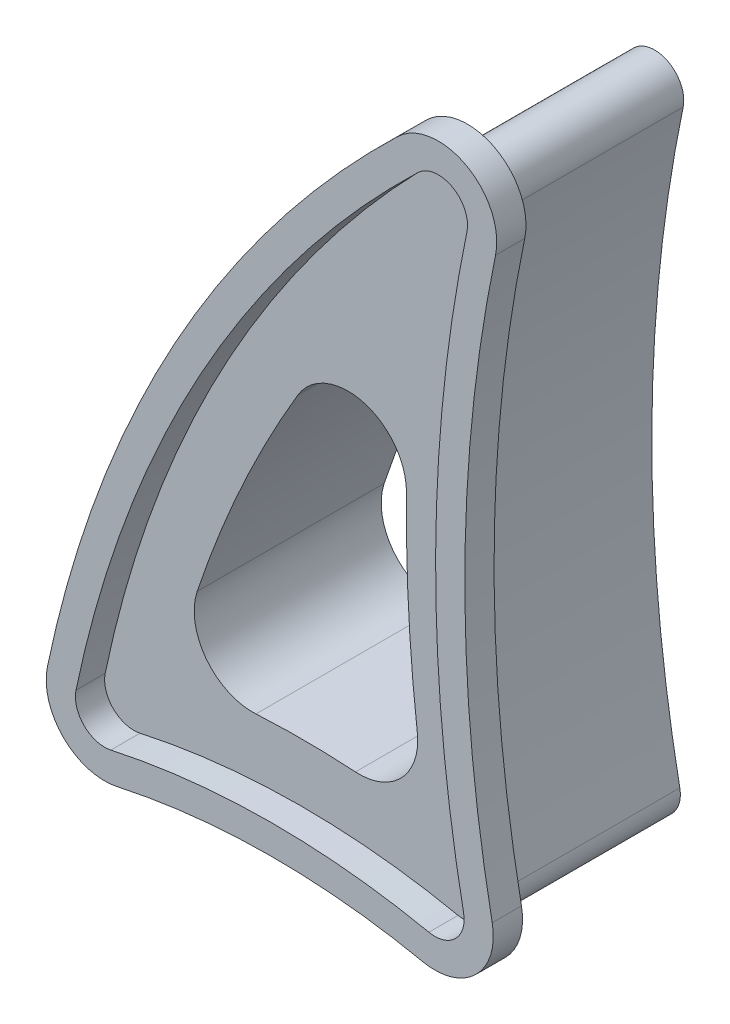
ISO-10303-21;
HEADER;
FILE_DESCRIPTION(('STEP AP214'),'2;1');
FILE_NAME('part.step','',(''),(''),'','','');
FILE_SCHEMA(('AUTOMOTIVE_DESIGN { 1 0 10303 214 1 1 1 1 }'));
ENDSEC;
DATA;
#1=APPLICATION_CONTEXT('core data for automotive mechanical design processes');
#2=APPLICATION_PROTOCOL_DEFINITION('international standard','automotive_design',2000,#1);
#3=PRODUCT_CONTEXT('',#1,'mechanical');
#4=PRODUCT('Part','Part','',(#3));
#5=PRODUCT_RELATED_PRODUCT_CATEGORY('part','',(#4));
#6=PRODUCT_DEFINITION_FORMATION('','',#4);
#7=PRODUCT_DEFINITION_CONTEXT('part definition',#1,'design');
#8=PRODUCT_DEFINITION('design','',#6,#7);
#9=PRODUCT_DEFINITION_SHAPE('','',#8);
#10=(LENGTH_UNIT() NAMED_UNIT(*) SI_UNIT(.MILLI.,.METRE.));
#11=(NAMED_UNIT(*) PLANE_ANGLE_UNIT() SI_UNIT($,.RADIAN.));
#12=(NAMED_UNIT(*) SI_UNIT($,.STERADIAN.) SOLID_ANGLE_UNIT());
#13=UNCERTAINTY_MEASURE_WITH_UNIT(LENGTH_MEASURE(1.E-05),#10,'distance_accuracy_value','');
#14=(GEOMETRIC_REPRESENTATION_CONTEXT(3) GLOBAL_UNCERTAINTY_ASSIGNED_CONTEXT((#13)) GLOBAL_UNIT_ASSIGNED_CONTEXT((#10,
#11,#12)) REPRESENTATION_CONTEXT('',''));
#15=CARTESIAN_POINT('',(0.,0.,0.));
#16=DIRECTION('',(0.,0.,1.));
#17=DIRECTION('',(1.,0.,0.));
#18=AXIS2_PLACEMENT_3D('',#15,#16,#17);
#19=CARTESIAN_POINT('',(48.320297770506,12.8510242148101,1.));
#20=DIRECTION('',(0.,0.,-1.));
#21=DIRECTION('',(-1.,0.,0.));
#22=AXIS2_PLACEMENT_3D('',#19,#20,#21);
#23=CYLINDRICAL_SURFACE('',#22,50.);
#24=CARTESIAN_POINT('',(48.320297770506,12.8510242148101,0.));
#25=DIRECTION('',(0.,0.,1.));
#26=DIRECTION('',(1.,0.,0.));
#27=AXIS2_PLACEMENT_3D('',#24,#25,#26);
#28=CIRCLE('',#27,50.);
#29=CARTESIAN_POINT('',(-0.741475267234573,3.21035896840541,0.));
#30=VERTEX_POINT('',#29);
#31=CARTESIAN_POINT('',(-0.628577803238606,23.0494348785397,0.));
#32=VERTEX_POINT('',#31);
#33=EDGE_CURVE('E190',#30,#32,#28,.F.);
#34=ORIENTED_EDGE('',*,*,#33,.T.);
#35=DIRECTION('',(0.,0.,-1.));
#36=VECTOR('',#35,1.);
#37=CARTESIAN_POINT('',(-0.628577803238606,23.0494348785397,1.));
#38=LINE('',#37,#36);
#39=CARTESIAN_POINT('',(-0.628577803238606,23.0494348785397,1.));
#40=VERTEX_POINT('',#39);
#41=EDGE_CURVE('E12',#40,#32,#38,.T.);
#42=ORIENTED_EDGE('',*,*,#41,.F.);
#43=CARTESIAN_POINT('',(48.320297770506,12.8510242148101,1.));
#44=DIRECTION('',(0.,0.,1.));
#45=DIRECTION('',(1.,0.,0.));
#46=AXIS2_PLACEMENT_3D('',#43,#44,#45);
#47=CIRCLE('',#46,50.);
#48=CARTESIAN_POINT('',(-0.741475267234573,3.21035896840541,1.));
#49=VERTEX_POINT('',#48);
#50=EDGE_CURVE('E249',#49,#40,#47,.F.);
#51=ORIENTED_EDGE('',*,*,#50,.F.);
#52=DIRECTION('',(0.,0.,-1.));
#53=VECTOR('',#52,1.);
#54=CARTESIAN_POINT('',(-0.741475267234573,3.21035896840541,1.));
#55=LINE('',#54,#53);
#56=EDGE_CURVE('E202',#49,#30,#55,.T.);
#57=ORIENTED_EDGE('',*,*,#56,.T.);
#58=EDGE_LOOP('',(#34,#42,#51,#57));
#59=FACE_BOUND('',#58,.T.);
#60=ADVANCED_FACE('F47',(#59),#23,.F.);
#61=CARTESIAN_POINT('',(-2.58653282618839,23.4573713050889,1.));
#62=DIRECTION('',(0.,0.,-1.));
#63=DIRECTION('',(-1.,0.,0.));
#64=AXIS2_PLACEMENT_3D('',#61,#62,#63);
#65=CYLINDRICAL_SURFACE('',#64,2.);
#66=CARTESIAN_POINT('',(-2.58653282618839,23.4573713050889,0.));
#67=DIRECTION('',(0.,0.,1.));
#68=DIRECTION('',(1.,0.,0.));
#69=AXIS2_PLACEMENT_3D('',#66,#67,#68);
#70=CIRCLE('',#69,2.);
#71=CARTESIAN_POINT('',(-3.97370372975359,24.8981200286011,0.));
#72=VERTEX_POINT('',#71);
#73=EDGE_CURVE('E193',#32,#72,#70,.T.);
#74=ORIENTED_EDGE('',*,*,#73,.T.);
#75=DIRECTION('',(0.,0.,-1.));
#76=VECTOR('',#75,1.);
#77=CARTESIAN_POINT('',(-3.97370372975359,24.8981200286011,1.));
#78=LINE('',#77,#76);
#79=CARTESIAN_POINT('',(-3.97370372975359,24.8981200286011,1.));
#80=VERTEX_POINT('',#79);
#81=EDGE_CURVE('E57',#80,#72,#78,.T.);
#82=ORIENTED_EDGE('',*,*,#81,.F.);
#83=CARTESIAN_POINT('',(-2.58653282618839,23.4573713050889,1.));
#84=DIRECTION('',(0.,0.,1.));
#85=DIRECTION('',(1.,0.,0.));
#86=AXIS2_PLACEMENT_3D('',#83,#84,#85);
#87=CIRCLE('',#86,2.);
#88=EDGE_CURVE('E166',#40,#80,#87,.T.);
#89=ORIENTED_EDGE('',*,*,#88,.F.);
#90=ORIENTED_EDGE('',*,*,#41,.T.);
#91=EDGE_LOOP('',(#74,#82,#89,#90));
#92=FACE_BOUND('',#91,.T.);
#93=ADVANCED_FACE('F254',(#92),#65,.T.);
#94=CARTESIAN_POINT('',(25.1568852451154,-5.35760316515583,1.));
#95=DIRECTION('',(0.,0.,-1.));
#96=DIRECTION('',(-1.,0.,0.));
#97=AXIS2_PLACEMENT_3D('',#94,#95,#96);
#98=CYLINDRICAL_SURFACE('',#97,42.);
#99=CARTESIAN_POINT('',(25.1568852451154,-5.35760316515583,0.));
#100=DIRECTION('',(0.,0.,1.));
#101=DIRECTION('',(1.,0.,0.));
#102=AXIS2_PLACEMENT_3D('',#99,#100,#101);
#103=CIRCLE('',#102,42.);
#104=CARTESIAN_POINT('',(-15.9648626723684,3.1865087378403,0.));
#105=VERTEX_POINT('',#104);
#106=EDGE_CURVE('E195',#72,#105,#103,.T.);
#107=ORIENTED_EDGE('',*,*,#106,.T.);
#108=DIRECTION('',(0.,0.,-1.));
#109=VECTOR('',#108,1.);
#110=CARTESIAN_POINT('',(-15.9648626723684,3.1865087378403,1.));
#111=LINE('',#110,#109);
#112=CARTESIAN_POINT('',(-15.9648626723684,3.1865087378403,1.));
#113=VERTEX_POINT('',#112);
#114=EDGE_CURVE('E155',#113,#105,#111,.T.);
#115=ORIENTED_EDGE('',*,*,#114,.F.);
#116=CARTESIAN_POINT('',(25.1568852451154,-5.35760316515583,1.));
#117=DIRECTION('',(0.,0.,1.));
#118=DIRECTION('',(1.,0.,0.));
#119=AXIS2_PLACEMENT_3D('',#116,#117,#118);
#120=CIRCLE('',#119,42.);
#121=EDGE_CURVE('E163',#80,#113,#120,.T.);
#122=ORIENTED_EDGE('',*,*,#121,.F.);
#123=ORIENTED_EDGE('',*,*,#81,.T.);
#124=EDGE_LOOP('',(#107,#115,#122,#123));
#125=FACE_BOUND('',#124,.T.);
#126=ADVANCED_FACE('F257',(#125),#98,.T.);
#127=CARTESIAN_POINT('',(-14.0066842001072,2.77964626626907,1.));
#128=DIRECTION('',(0.,0.,-1.));
#129=DIRECTION('',(-1.,0.,0.));
#130=AXIS2_PLACEMENT_3D('',#127,#128,#129);
#131=CYLINDRICAL_SURFACE('',#130,2.);
#132=CARTESIAN_POINT('',(-14.0066842001072,2.77964626626907,0.));
#133=DIRECTION('',(0.,0.,1.));
#134=DIRECTION('',(1.,0.,0.));
#135=AXIS2_PLACEMENT_3D('',#132,#133,#134);
#136=CIRCLE('',#135,2.);
#137=CARTESIAN_POINT('',(-13.5802631482474,0.825633705784666,0.));
#138=VERTEX_POINT('',#137);
#139=EDGE_CURVE('E154',#138,#105,#136,.F.);
#140=ORIENTED_EDGE('',*,*,#139,.F.);
#141=DIRECTION('',(0.,0.,-1.));
#142=VECTOR('',#141,1.);
#143=CARTESIAN_POINT('',(-13.5802631482474,0.825633705784666,1.));
#144=LINE('',#143,#142);
#145=CARTESIAN_POINT('',(-13.5802631482474,0.825633705784666,1.));
#146=VERTEX_POINT('',#145);
#147=EDGE_CURVE('E148',#146,#138,#144,.T.);
#148=ORIENTED_EDGE('',*,*,#147,.F.);
#149=CARTESIAN_POINT('',(-14.0066842001072,2.77964626626907,1.));
#150=DIRECTION('',(0.,0.,1.));
#151=DIRECTION('',(1.,0.,0.));
#152=AXIS2_PLACEMENT_3D('',#149,#150,#151);
#153=CIRCLE('',#152,2.);
#154=EDGE_CURVE('E152',#146,#113,#153,.F.);
#155=ORIENTED_EDGE('',*,*,#154,.T.);
#156=ORIENTED_EDGE('',*,*,#114,.T.);
#157=EDGE_LOOP('',(#140,#148,#155,#156));
#158=FACE_BOUND('',#157,.T.);
#159=ADVANCED_FACE('F150',(#158),#131,.T.);
#160=CARTESIAN_POINT('',(-8.25,-23.5995233002703,1.));
#161=DIRECTION('',(0.,0.,-1.));
#162=DIRECTION('',(-1.,0.,0.));
#163=AXIS2_PLACEMENT_3D('',#160,#161,#162);
#164=CYLINDRICAL_SURFACE('',#163,25.);
#165=CARTESIAN_POINT('',(-8.25,-23.5995233002703,0.));
#166=DIRECTION('',(0.,0.,1.));
#167=DIRECTION('',(1.,0.,0.));
#168=AXIS2_PLACEMENT_3D('',#165,#166,#167);
#169=CIRCLE('',#168,25.);
#170=CARTESIAN_POINT('',(-3.11476498957796,0.867380087525561,0.));
#171=VERTEX_POINT('',#170);
#172=EDGE_CURVE('E106',#138,#171,#169,.F.);
#173=ORIENTED_EDGE('',*,*,#172,.T.);
#174=DIRECTION('',(0.,0.,-1.));
#175=VECTOR('',#174,1.);
#176=CARTESIAN_POINT('',(-3.11476498957796,0.867380087525561,1.));
#177=LINE('',#176,#175);
#178=CARTESIAN_POINT('',(-3.11476498957796,0.867380087525561,1.));
#179=VERTEX_POINT('',#178);
#180=EDGE_CURVE('E156',#179,#171,#177,.T.);
#181=ORIENTED_EDGE('',*,*,#180,.F.);
#182=CARTESIAN_POINT('',(-8.25,-23.5995233002703,1.));
#183=DIRECTION('',(0.,0.,1.));
#184=DIRECTION('',(1.,0.,0.));
#185=AXIS2_PLACEMENT_3D('',#182,#183,#184);
#186=CIRCLE('',#185,25.);
#187=EDGE_CURVE('E158',#146,#179,#186,.F.);
#188=ORIENTED_EDGE('',*,*,#187,.F.);
#189=ORIENTED_EDGE('',*,*,#147,.T.);
#190=EDGE_LOOP('',(#173,#181,#188,#189));
#191=FACE_BOUND('',#190,.T.);
#192=ADVANCED_FACE('F159',(#191),#164,.F.);
#193=CARTESIAN_POINT('',(-2.58653282618839,23.4573713050889,1.));
#194=DIRECTION('',(0.,0.,-1.));
#195=DIRECTION('',(-1.,0.,0.));
#196=AXIS2_PLACEMENT_3D('',#193,#194,#195);
#197=CYLINDRICAL_SURFACE('',#196,1.);
#198=CARTESIAN_POINT('',(-2.58653282618839,23.4573713050889,0.));
#199=DIRECTION('',(0.,0.,1.));
#200=DIRECTION('',(1.,0.,0.));
#201=AXIS2_PLACEMENT_3D('',#198,#199,#200);
#202=CIRCLE('',#201,1.);
#203=CARTESIAN_POINT('',(-1.60755531471349,23.2534030918143,0.));
#204=VERTEX_POINT('',#203);
#205=CARTESIAN_POINT('',(-3.28011827797098,24.177745666845,0.));
#206=VERTEX_POINT('',#205);
#207=EDGE_CURVE('E172',#204,#206,#202,.T.);
#208=ORIENTED_EDGE('',*,*,#207,.F.);
#209=DIRECTION('',(0.,0.,-1.));
#210=VECTOR('',#209,1.);
#211=CARTESIAN_POINT('',(-1.60755531471349,23.2534030918143,1.));
#212=LINE('',#211,#210);
#213=CARTESIAN_POINT('',(-1.60755531471349,23.2534030918143,1.));
#214=VERTEX_POINT('',#213);
#215=EDGE_CURVE('E51',#214,#204,#212,.T.);
#216=ORIENTED_EDGE('',*,*,#215,.F.);
#217=CARTESIAN_POINT('',(-2.58653282618839,23.4573713050889,1.));
#218=DIRECTION('',(0.,0.,1.));
#219=DIRECTION('',(1.,0.,0.));
#220=AXIS2_PLACEMENT_3D('',#217,#218,#219);
#221=CIRCLE('',#220,1.);
#222=CARTESIAN_POINT('',(-3.28011827797098,24.177745666845,1.));
#223=VERTEX_POINT('',#222);
#224=EDGE_CURVE('E201',#214,#223,#221,.T.);
#225=ORIENTED_EDGE('',*,*,#224,.T.);
#226=DIRECTION('',(0.,0.,-1.));
#227=VECTOR('',#226,1.);
#228=CARTESIAN_POINT('',(-3.28011827797098,24.177745666845,1.));
#229=LINE('',#228,#227);
#230=EDGE_CURVE('E171',#223,#206,#229,.T.);
#231=ORIENTED_EDGE('',*,*,#230,.T.);
#232=EDGE_LOOP('',(#208,#216,#225,#231));
#233=FACE_BOUND('',#232,.T.);
#234=ADVANCED_FACE('F49',(#233),#197,.F.);
#235=CARTESIAN_POINT('',(48.320297770506,12.8510242148101,1.));
#236=DIRECTION('',(0.,0.,-1.));
#237=DIRECTION('',(-1.,0.,0.));
#238=AXIS2_PLACEMENT_3D('',#235,#236,#237);
#239=CYLINDRICAL_SURFACE('',#238,51.);
#240=CARTESIAN_POINT('',(48.320297770506,12.8510242148101,0.));
#241=DIRECTION('',(0.,0.,1.));
#242=DIRECTION('',(1.,0.,0.));
#243=AXIS2_PLACEMENT_3D('',#240,#241,#242);
#244=CIRCLE('',#243,51.);
#245=CARTESIAN_POINT('',(-1.72271072798938,3.01754566347732,0.));
#246=VERTEX_POINT('',#245);
#247=EDGE_CURVE('E175',#246,#204,#244,.F.);
#248=ORIENTED_EDGE('',*,*,#247,.F.);
#249=DIRECTION('',(0.,0.,-1.));
#250=VECTOR('',#249,1.);
#251=CARTESIAN_POINT('',(-1.72271072798938,3.01754566347732,1.));
#252=LINE('',#251,#250);
#253=CARTESIAN_POINT('',(-1.72271072798938,3.01754566347732,1.));
#254=VERTEX_POINT('',#253);
#255=EDGE_CURVE('E214',#254,#246,#252,.T.);
#256=ORIENTED_EDGE('',*,*,#255,.F.);
#257=CARTESIAN_POINT('',(48.320297770506,12.8510242148101,1.));
#258=DIRECTION('',(0.,0.,1.));
#259=DIRECTION('',(1.,0.,0.));
#260=AXIS2_PLACEMENT_3D('',#257,#258,#259);
#261=CIRCLE('',#260,51.);
#262=EDGE_CURVE('E223',#254,#214,#261,.F.);
#263=ORIENTED_EDGE('',*,*,#262,.T.);
#264=ORIENTED_EDGE('',*,*,#215,.T.);
#265=EDGE_LOOP('',(#248,#256,#263,#264));
#266=FACE_BOUND('',#265,.T.);
#267=ADVANCED_FACE('F221',(#266),#239,.T.);
#268=CARTESIAN_POINT('',(-2.70394618874419,2.82473235854923,1.));
#269=DIRECTION('',(0.,0.,-1.));
#270=DIRECTION('',(-1.,0.,0.));
#271=AXIS2_PLACEMENT_3D('',#268,#269,#270);
#272=CYLINDRICAL_SURFACE('',#271,1.);
#273=CARTESIAN_POINT('',(-2.70394618874419,2.82473235854923,0.));
#274=DIRECTION('',(0.,0.,1.));
#275=DIRECTION('',(1.,0.,0.));
#276=AXIS2_PLACEMENT_3D('',#273,#274,#275);
#277=CIRCLE('',#276,1.);
#278=CARTESIAN_POINT('',(-2.90935558916107,1.84605622303739,0.));
#279=VERTEX_POINT('',#278);
#280=EDGE_CURVE('E178',#279,#246,#277,.T.);
#281=ORIENTED_EDGE('',*,*,#280,.F.);
#282=DIRECTION('',(0.,0.,-1.));
#283=VECTOR('',#282,1.);
#284=CARTESIAN_POINT('',(-2.90935558916107,1.84605622303739,1.));
#285=LINE('',#284,#283);
#286=CARTESIAN_POINT('',(-2.90935558916107,1.84605622303739,1.));
#287=VERTEX_POINT('',#286);
#288=EDGE_CURVE('E213',#287,#279,#285,.T.);
#289=ORIENTED_EDGE('',*,*,#288,.F.);
#290=CARTESIAN_POINT('',(-2.70394618874419,2.82473235854923,1.));
#291=DIRECTION('',(0.,0.,1.));
#292=DIRECTION('',(1.,0.,0.));
#293=AXIS2_PLACEMENT_3D('',#290,#291,#292);
#294=CIRCLE('',#293,1.);
#295=EDGE_CURVE('E232',#287,#254,#294,.T.);
#296=ORIENTED_EDGE('',*,*,#295,.T.);
#297=ORIENTED_EDGE('',*,*,#255,.T.);
#298=EDGE_LOOP('',(#281,#289,#296,#297));
#299=FACE_BOUND('',#298,.T.);
#300=ADVANCED_FACE('F230',(#299),#272,.F.);
#301=CARTESIAN_POINT('',(-8.25,-23.5995233002703,1.));
#302=DIRECTION('',(0.,0.,-1.));
#303=DIRECTION('',(-1.,0.,0.));
#304=AXIS2_PLACEMENT_3D('',#301,#302,#303);
#305=CYLINDRICAL_SURFACE('',#304,26.);
#306=CARTESIAN_POINT('',(-8.25,-23.5995233002703,0.));
#307=DIRECTION('',(0.,0.,1.));
#308=DIRECTION('',(1.,0.,0.));
#309=AXIS2_PLACEMENT_3D('',#306,#307,#308);
#310=CIRCLE('',#309,26.);
#311=CARTESIAN_POINT('',(-13.7934736741773,1.80263998602687,0.));
#312=VERTEX_POINT('',#311);
#313=EDGE_CURVE('E181',#312,#279,#310,.F.);
#314=ORIENTED_EDGE('',*,*,#313,.F.);
#315=DIRECTION('',(0.,0.,-1.));
#316=VECTOR('',#315,1.);
#317=CARTESIAN_POINT('',(-13.7934736741773,1.80263998602687,1.));
#318=LINE('',#317,#316);
#319=CARTESIAN_POINT('',(-13.7934736741773,1.80263998602687,1.));
#320=VERTEX_POINT('',#319);
#321=EDGE_CURVE('E211',#320,#312,#318,.T.);
#322=ORIENTED_EDGE('',*,*,#321,.F.);
#323=CARTESIAN_POINT('',(-8.25,-23.5995233002703,1.));
#324=DIRECTION('',(0.,0.,1.));
#325=DIRECTION('',(1.,0.,0.));
#326=AXIS2_PLACEMENT_3D('',#323,#324,#325);
#327=CIRCLE('',#326,26.);
#328=EDGE_CURVE('E237',#320,#287,#327,.F.);
#329=ORIENTED_EDGE('',*,*,#328,.T.);
#330=ORIENTED_EDGE('',*,*,#288,.T.);
#331=EDGE_LOOP('',(#314,#322,#329,#330));
#332=FACE_BOUND('',#331,.T.);
#333=ADVANCED_FACE('F239',(#332),#305,.T.);
#334=CARTESIAN_POINT('',(-14.0066842001072,2.77964626626907,1.));
#335=DIRECTION('',(0.,0.,-1.));
#336=DIRECTION('',(-1.,0.,0.));
#337=AXIS2_PLACEMENT_3D('',#334,#335,#336);
#338=CYLINDRICAL_SURFACE('',#337,0.999999999999997);
#339=CARTESIAN_POINT('',(-14.0066842001072,2.77964626626907,0.));
#340=DIRECTION('',(0.,0.,1.));
#341=DIRECTION('',(1.,0.,0.));
#342=AXIS2_PLACEMENT_3D('',#339,#340,#341);
#343=CIRCLE('',#342,0.999999999999997);
#344=CARTESIAN_POINT('',(-14.9857734362378,2.9830775020547,0.));
#345=VERTEX_POINT('',#344);
#346=EDGE_CURVE('E184',#312,#345,#343,.F.);
#347=ORIENTED_EDGE('',*,*,#346,.T.);
#348=DIRECTION('',(0.,0.,-1.));
#349=VECTOR('',#348,1.);
#350=CARTESIAN_POINT('',(-14.9857734362378,2.9830775020547,1.));
#351=LINE('',#350,#349);
#352=CARTESIAN_POINT('',(-14.9857734362378,2.9830775020547,1.));
#353=VERTEX_POINT('',#352);
#354=EDGE_CURVE('E209',#353,#345,#351,.T.);
#355=ORIENTED_EDGE('',*,*,#354,.F.);
#356=CARTESIAN_POINT('',(-14.0066842001072,2.77964626626907,1.));
#357=DIRECTION('',(0.,0.,1.));
#358=DIRECTION('',(1.,0.,0.));
#359=AXIS2_PLACEMENT_3D('',#356,#357,#358);
#360=CIRCLE('',#359,0.999999999999997);
#361=EDGE_CURVE('E241',#320,#353,#360,.F.);
#362=ORIENTED_EDGE('',*,*,#361,.F.);
#363=ORIENTED_EDGE('',*,*,#321,.T.);
#364=EDGE_LOOP('',(#347,#355,#362,#363));
#365=FACE_BOUND('',#364,.T.);
#366=ADVANCED_FACE('F269',(#365),#338,.F.);
#367=CARTESIAN_POINT('',(25.1568852451154,-5.35760316515583,1.));
#368=DIRECTION('',(0.,0.,-1.));
#369=DIRECTION('',(-1.,0.,0.));
#370=AXIS2_PLACEMENT_3D('',#367,#368,#369);
#371=CYLINDRICAL_SURFACE('',#370,41.);
#372=CARTESIAN_POINT('',(25.1568852451154,-5.35760316515583,0.));
#373=DIRECTION('',(0.,0.,1.));
#374=DIRECTION('',(1.,0.,0.));
#375=AXIS2_PLACEMENT_3D('',#372,#373,#374);
#376=CIRCLE('',#375,41.);
#377=EDGE_CURVE('E187',#206,#345,#376,.T.);
#378=ORIENTED_EDGE('',*,*,#377,.F.);
#379=ORIENTED_EDGE('',*,*,#230,.F.);
#380=CARTESIAN_POINT('',(25.1568852451154,-5.35760316515583,1.));
#381=DIRECTION('',(0.,0.,1.));
#382=DIRECTION('',(1.,0.,0.));
#383=AXIS2_PLACEMENT_3D('',#380,#381,#382);
#384=CIRCLE('',#383,41.);
#385=EDGE_CURVE('E243',#223,#353,#384,.T.);
#386=ORIENTED_EDGE('',*,*,#385,.T.);
#387=ORIENTED_EDGE('',*,*,#354,.T.);
#388=EDGE_LOOP('',(#378,#379,#386,#387));
#389=FACE_BOUND('',#388,.T.);
#390=ADVANCED_FACE('F262',(#389),#371,.F.);
#391=CARTESIAN_POINT('',(-2.70394618874419,2.82473235854923,1.));
#392=DIRECTION('',(0.,0.,-1.));
#393=DIRECTION('',(-1.,0.,0.));
#394=AXIS2_PLACEMENT_3D('',#391,#392,#393);
#395=CYLINDRICAL_SURFACE('',#394,2.);
#396=CARTESIAN_POINT('',(-2.70394618874419,2.82473235854923,0.));
#397=DIRECTION('',(0.,0.,1.));
#398=DIRECTION('',(1.,0.,0.));
#399=AXIS2_PLACEMENT_3D('',#396,#397,#398);
#400=CIRCLE('',#399,2.);
#401=EDGE_CURVE('E112',#171,#30,#400,.T.);
#402=ORIENTED_EDGE('',*,*,#401,.T.);
#403=ORIENTED_EDGE('',*,*,#56,.F.);
#404=CARTESIAN_POINT('',(-2.70394618874419,2.82473235854923,1.));
#405=DIRECTION('',(0.,0.,1.));
#406=DIRECTION('',(1.,0.,0.));
#407=AXIS2_PLACEMENT_3D('',#404,#405,#406);
#408=CIRCLE('',#407,2.);
#409=EDGE_CURVE('E66',#179,#49,#408,.T.);
#410=ORIENTED_EDGE('',*,*,#409,.F.);
#411=ORIENTED_EDGE('',*,*,#180,.T.);
#412=EDGE_LOOP('',(#402,#403,#410,#411));
#413=FACE_BOUND('',#412,.T.);
#414=ADVANCED_FACE('F260',(#413),#395,.T.);
#415=CARTESIAN_POINT('',(0.,0.,1.));
#416=DIRECTION('',(0.,0.,1.));
#417=DIRECTION('',(1.,0.,0.));
#418=AXIS2_PLACEMENT_3D('',#415,#416,#417);
#419=PLANE('',#418);
#420=ORIENTED_EDGE('',*,*,#224,.F.);
#421=ORIENTED_EDGE('',*,*,#262,.F.);
#422=ORIENTED_EDGE('',*,*,#295,.F.);
#423=ORIENTED_EDGE('',*,*,#328,.F.);
#424=ORIENTED_EDGE('',*,*,#361,.T.);
#425=ORIENTED_EDGE('',*,*,#385,.F.);
#426=EDGE_LOOP('',(#420,#421,#422,#423,#424,#425));
#427=FACE_BOUND('',#426,.T.);
#428=ORIENTED_EDGE('',*,*,#50,.T.);
#429=ORIENTED_EDGE('',*,*,#88,.T.);
#430=ORIENTED_EDGE('',*,*,#121,.T.);
#431=ORIENTED_EDGE('',*,*,#154,.F.);
#432=ORIENTED_EDGE('',*,*,#187,.T.);
#433=ORIENTED_EDGE('',*,*,#409,.T.);
#434=EDGE_LOOP('',(#428,#429,#430,#431,#432,#433));
#435=FACE_BOUND('',#434,.T.);
#436=ADVANCED_FACE('F161',(#427,#435),#419,.T.);
#437=CARTESIAN_POINT('',(0.,0.,0.));
#438=DIRECTION('',(0.,0.,1.));
#439=DIRECTION('',(1.,0.,0.));
#440=AXIS2_PLACEMENT_3D('',#437,#438,#439);
#441=PLANE('',#440);
#442=ORIENTED_EDGE('',*,*,#207,.T.);
#443=ORIENTED_EDGE('',*,*,#377,.T.);
#444=ORIENTED_EDGE('',*,*,#346,.F.);
#445=ORIENTED_EDGE('',*,*,#313,.T.);
#446=ORIENTED_EDGE('',*,*,#280,.T.);
#447=ORIENTED_EDGE('',*,*,#247,.T.);
#448=EDGE_LOOP('',(#442,#443,#444,#445,#446,#447));
#449=FACE_BOUND('',#448,.T.);
#450=ORIENTED_EDGE('',*,*,#33,.F.);
#451=ORIENTED_EDGE('',*,*,#401,.F.);
#452=ORIENTED_EDGE('',*,*,#172,.F.);
#453=ORIENTED_EDGE('',*,*,#139,.T.);
#454=ORIENTED_EDGE('',*,*,#106,.F.);
#455=ORIENTED_EDGE('',*,*,#73,.F.);
#456=EDGE_LOOP('',(#450,#451,#452,#453,#454,#455));
#457=FACE_BOUND('',#456,.T.);
#458=ADVANCED_FACE('F226',(#449,#457),#441,.F.);
#459=CLOSED_SHELL('',(#60,#93,#126,#159,#192,#234,#267,#300,#333,#366,#390,#414,#436,#458));
#460=MANIFOLD_SOLID_BREP('B2',#459);
#461=CARTESIAN_POINT('',(48.320297770506,12.8510242148101,-6.4));
#462=DIRECTION('',(0.,0.,1.));
#463=DIRECTION('',(1.,0.,0.));
#464=AXIS2_PLACEMENT_3D('',#461,#462,#463);
#465=CYLINDRICAL_SURFACE('',#464,51.);
#466=CARTESIAN_POINT('',(48.320297770506,12.8510242148101,0.));
#467=DIRECTION('',(0.,0.,1.));
#468=DIRECTION('',(1.,0.,0.));
#469=AXIS2_PLACEMENT_3D('',#466,#467,#468);
#470=CIRCLE('',#469,51.);
#471=CARTESIAN_POINT('',(-1.72271072798938,3.01754566347732,0.));
#472=VERTEX_POINT('',#471);
#473=CARTESIAN_POINT('',(-1.60755531471349,23.2534030918143,0.));
#474=VERTEX_POINT('',#473);
#475=EDGE_CURVE('E518',#472,#474,#470,.F.);
#476=ORIENTED_EDGE('',*,*,#475,.F.);
#477=DIRECTION('',(0.,0.,1.));
#478=VECTOR('',#477,1.);
#479=CARTESIAN_POINT('',(-1.72271072798938,3.01754566347732,-6.4));
#480=LINE('',#479,#478);
#481=CARTESIAN_POINT('',(-1.72271072798938,3.01754566347732,-6.4));
#482=VERTEX_POINT('',#481);
#483=EDGE_CURVE('E45',#482,#472,#480,.T.);
#484=ORIENTED_EDGE('',*,*,#483,.F.);
#485=CARTESIAN_POINT('',(48.320297770506,12.8510242148101,-6.4));
#486=DIRECTION('',(0.,0.,1.));
#487=DIRECTION('',(1.,0.,0.));
#488=AXIS2_PLACEMENT_3D('',#485,#486,#487);
#489=CIRCLE('',#488,51.);
#490=CARTESIAN_POINT('',(-1.60755531471349,23.2534030918143,-6.4));
#491=VERTEX_POINT('',#490);
#492=EDGE_CURVE('E569',#482,#491,#489,.F.);
#493=ORIENTED_EDGE('',*,*,#492,.T.);
#494=DIRECTION('',(0.,0.,1.));
#495=VECTOR('',#494,1.);
#496=CARTESIAN_POINT('',(-1.60755531471349,23.2534030918143,-6.4));
#497=LINE('',#496,#495);
#498=EDGE_CURVE('E538',#491,#474,#497,.T.);
#499=ORIENTED_EDGE('',*,*,#498,.T.);
#500=EDGE_LOOP('',(#476,#484,#493,#499));
#501=FACE_BOUND('',#500,.T.);
#502=ADVANCED_FACE('F381',(#501),#465,.F.);
#503=CARTESIAN_POINT('',(-2.70394618874419,2.82473235854923,-6.4));
#504=DIRECTION('',(0.,0.,1.));
#505=DIRECTION('',(1.,0.,0.));
#506=AXIS2_PLACEMENT_3D('',#503,#504,#505);
#507=CYLINDRICAL_SURFACE('',#506,1.);
#508=CARTESIAN_POINT('',(-2.70394618874419,2.82473235854923,0.));
#509=DIRECTION('',(0.,0.,1.));
#510=DIRECTION('',(1.,0.,0.));
#511=AXIS2_PLACEMENT_3D('',#508,#509,#510);
#512=CIRCLE('',#511,1.);
#513=CARTESIAN_POINT('',(-2.90935558916107,1.84605622303739,0.));
#514=VERTEX_POINT('',#513);
#515=EDGE_CURVE('E530',#514,#472,#512,.T.);
#516=ORIENTED_EDGE('',*,*,#515,.F.);
#517=DIRECTION('',(0.,0.,1.));
#518=VECTOR('',#517,1.);
#519=CARTESIAN_POINT('',(-2.90935558916107,1.84605622303739,-6.4));
#520=LINE('',#519,#518);
#521=CARTESIAN_POINT('',(-2.90935558916107,1.84605622303739,-6.4));
#522=VERTEX_POINT('',#521);
#523=EDGE_CURVE('E391',#522,#514,#520,.T.);
#524=ORIENTED_EDGE('',*,*,#523,.F.);
#525=CARTESIAN_POINT('',(-2.70394618874419,2.82473235854923,-6.4));
#526=DIRECTION('',(0.,0.,1.));
#527=DIRECTION('',(1.,0.,0.));
#528=AXIS2_PLACEMENT_3D('',#525,#526,#527);
#529=CIRCLE('',#528,1.);
#530=EDGE_CURVE('E498',#522,#482,#529,.T.);
#531=ORIENTED_EDGE('',*,*,#530,.T.);
#532=ORIENTED_EDGE('',*,*,#483,.T.);
#533=EDGE_LOOP('',(#516,#524,#531,#532));
#534=FACE_BOUND('',#533,.T.);
#535=ADVANCED_FACE('F591',(#534),#507,.T.);
#536=CARTESIAN_POINT('',(-8.25,-23.5995233002703,-6.4));
#537=DIRECTION('',(0.,0.,1.));
#538=DIRECTION('',(1.,0.,0.));
#539=AXIS2_PLACEMENT_3D('',#536,#537,#538);
#540=CYLINDRICAL_SURFACE('',#539,26.);
#541=CARTESIAN_POINT('',(-8.25,-23.5995233002703,0.));
#542=DIRECTION('',(0.,0.,1.));
#543=DIRECTION('',(1.,0.,0.));
#544=AXIS2_PLACEMENT_3D('',#541,#542,#543);
#545=CIRCLE('',#544,26.);
#546=CARTESIAN_POINT('',(-13.7934736741773,1.80263998602687,0.));
#547=VERTEX_POINT('',#546);
#548=EDGE_CURVE('E483',#547,#514,#545,.F.);
#549=ORIENTED_EDGE('',*,*,#548,.F.);
#550=DIRECTION('',(0.,0.,1.));
#551=VECTOR('',#550,1.);
#552=CARTESIAN_POINT('',(-13.7934736741773,1.80263998602687,-6.4));
#553=LINE('',#552,#551);
#554=CARTESIAN_POINT('',(-13.7934736741773,1.80263998602687,-6.4));
#555=VERTEX_POINT('',#554);
#556=EDGE_CURVE('E477',#555,#547,#553,.T.);
#557=ORIENTED_EDGE('',*,*,#556,.F.);
#558=CARTESIAN_POINT('',(-8.25,-23.5995233002703,-6.4));
#559=DIRECTION('',(0.,0.,1.));
#560=DIRECTION('',(1.,0.,0.));
#561=AXIS2_PLACEMENT_3D('',#558,#559,#560);
#562=CIRCLE('',#561,26.);
#563=EDGE_CURVE('E481',#555,#522,#562,.F.);
#564=ORIENTED_EDGE('',*,*,#563,.T.);
#565=ORIENTED_EDGE('',*,*,#523,.T.);
#566=EDGE_LOOP('',(#549,#557,#564,#565));
#567=FACE_BOUND('',#566,.T.);
#568=ADVANCED_FACE('F479',(#567),#540,.F.);
#569=CARTESIAN_POINT('',(-14.0066842001072,2.77964626626907,-6.4));
#570=DIRECTION('',(0.,0.,1.));
#571=DIRECTION('',(1.,0.,0.));
#572=AXIS2_PLACEMENT_3D('',#569,#570,#571);
#573=CYLINDRICAL_SURFACE('',#572,0.999999999999997);
#574=CARTESIAN_POINT('',(-14.0066842001072,2.77964626626907,0.));
#575=DIRECTION('',(0.,0.,1.));
#576=DIRECTION('',(1.,0.,0.));
#577=AXIS2_PLACEMENT_3D('',#574,#575,#576);
#578=CIRCLE('',#577,0.999999999999997);
#579=CARTESIAN_POINT('',(-14.9857734362378,2.9830775020547,0.));
#580=VERTEX_POINT('',#579);
#581=EDGE_CURVE('E527',#547,#580,#578,.F.);
#582=ORIENTED_EDGE('',*,*,#581,.T.);
#583=DIRECTION('',(0.,0.,1.));
#584=VECTOR('',#583,1.);
#585=CARTESIAN_POINT('',(-14.9857734362378,2.9830775020547,-6.4));
#586=LINE('',#585,#584);
#587=CARTESIAN_POINT('',(-14.9857734362378,2.9830775020547,-6.4));
#588=VERTEX_POINT('',#587);
#589=EDGE_CURVE('E487',#588,#580,#586,.T.);
#590=ORIENTED_EDGE('',*,*,#589,.F.);
#591=CARTESIAN_POINT('',(-14.0066842001072,2.77964626626907,-6.4));
#592=DIRECTION('',(0.,0.,1.));
#593=DIRECTION('',(1.,0.,0.));
#594=AXIS2_PLACEMENT_3D('',#591,#592,#593);
#595=CIRCLE('',#594,0.999999999999997);
#596=EDGE_CURVE('E490',#555,#588,#595,.F.);
#597=ORIENTED_EDGE('',*,*,#596,.F.);
#598=ORIENTED_EDGE('',*,*,#556,.T.);
#599=EDGE_LOOP('',(#582,#590,#597,#598));
#600=FACE_BOUND('',#599,.T.);
#601=ADVANCED_FACE('F491',(#600),#573,.T.);
#602=CARTESIAN_POINT('',(25.1568852451154,-5.35760316515583,-6.4));
#603=DIRECTION('',(0.,0.,1.));
#604=DIRECTION('',(1.,0.,0.));
#605=AXIS2_PLACEMENT_3D('',#602,#603,#604);
#606=CYLINDRICAL_SURFACE('',#605,41.);
#607=CARTESIAN_POINT('',(25.1568852451154,-5.35760316515583,0.));
#608=DIRECTION('',(0.,0.,1.));
#609=DIRECTION('',(1.,0.,0.));
#610=AXIS2_PLACEMENT_3D('',#607,#608,#609);
#611=CIRCLE('',#610,41.);
#612=CARTESIAN_POINT('',(-3.28011827797098,24.177745666845,0.));
#613=VERTEX_POINT('',#612);
#614=EDGE_CURVE('E524',#613,#580,#611,.T.);
#615=ORIENTED_EDGE('',*,*,#614,.F.);
#616=DIRECTION('',(0.,0.,1.));
#617=VECTOR('',#616,1.);
#618=CARTESIAN_POINT('',(-3.28011827797098,24.177745666845,-6.4));
#619=LINE('',#618,#617);
#620=CARTESIAN_POINT('',(-3.28011827797098,24.177745666845,-6.4));
#621=VERTEX_POINT('',#620);
#622=EDGE_CURVE('E536',#621,#613,#619,.T.);
#623=ORIENTED_EDGE('',*,*,#622,.F.);
#624=CARTESIAN_POINT('',(25.1568852451154,-5.35760316515583,-6.4));
#625=DIRECTION('',(0.,0.,1.));
#626=DIRECTION('',(1.,0.,0.));
#627=AXIS2_PLACEMENT_3D('',#624,#625,#626);
#628=CIRCLE('',#627,41.);
#629=EDGE_CURVE('E495',#621,#588,#628,.T.);
#630=ORIENTED_EDGE('',*,*,#629,.T.);
#631=ORIENTED_EDGE('',*,*,#589,.T.);
#632=EDGE_LOOP('',(#615,#623,#630,#631));
#633=FACE_BOUND('',#632,.T.);
#634=ADVANCED_FACE('F586',(#633),#606,.T.);
#635=CARTESIAN_POINT('',(-6.29253582125286,6.33654748380092,-6.4));
#636=DIRECTION('',(0.,0.,1.));
#637=DIRECTION('',(1.,0.,0.));
#638=AXIS2_PLACEMENT_3D('',#635,#636,#637);
#639=CYLINDRICAL_SURFACE('',#638,2.);
#640=CARTESIAN_POINT('',(-6.29253582125286,6.33654748380092,0.));
#641=DIRECTION('',(0.,0.,1.));
#642=DIRECTION('',(1.,0.,0.));
#643=AXIS2_PLACEMENT_3D('',#640,#641,#642);
#644=CIRCLE('',#643,2.);
#645=CARTESIAN_POINT('',(-6.42303343316933,4.34080943152951,0.));
#646=VERTEX_POINT('',#645);
#647=CARTESIAN_POINT('',(-4.30661459973436,6.57343754674671,0.));
#648=VERTEX_POINT('',#647);
#649=EDGE_CURVE('E503',#646,#648,#644,.T.);
#650=ORIENTED_EDGE('',*,*,#649,.T.);
#651=DIRECTION('',(0.,0.,1.));
#652=VECTOR('',#651,1.);
#653=CARTESIAN_POINT('',(-4.30661459973436,6.57343754674671,-6.4));
#654=LINE('',#653,#652);
#655=CARTESIAN_POINT('',(-4.30661459973436,6.57343754674671,-6.4));
#656=VERTEX_POINT('',#655);
#657=EDGE_CURVE('E540',#656,#648,#654,.T.);
#658=ORIENTED_EDGE('',*,*,#657,.F.);
#659=CARTESIAN_POINT('',(-6.29253582125286,6.33654748380092,-6.4));
#660=DIRECTION('',(0.,0.,1.));
#661=DIRECTION('',(1.,0.,0.));
#662=AXIS2_PLACEMENT_3D('',#659,#660,#661);
#663=CIRCLE('',#662,2.);
#664=CARTESIAN_POINT('',(-6.42303343316933,4.34080943152951,-6.4));
#665=VERTEX_POINT('',#664);
#666=EDGE_CURVE('E532',#665,#656,#663,.T.);
#667=ORIENTED_EDGE('',*,*,#666,.F.);
#668=DIRECTION('',(0.,0.,1.));
#669=VECTOR('',#668,1.);
#670=CARTESIAN_POINT('',(-6.42303343316933,4.34080943152951,-6.4));
#671=LINE('',#670,#669);
#672=EDGE_CURVE('E385',#665,#646,#671,.T.);
#673=ORIENTED_EDGE('',*,*,#672,.T.);
#674=EDGE_LOOP('',(#650,#658,#667,#673));
#675=FACE_BOUND('',#674,.T.);
#676=ADVANCED_FACE('F383',(#675),#639,.F.);
#677=CARTESIAN_POINT('',(48.320297770506,12.8510242148101,-6.4));
#678=DIRECTION('',(0.,0.,1.));
#679=DIRECTION('',(1.,0.,0.));
#680=AXIS2_PLACEMENT_3D('',#677,#678,#679);
#681=CYLINDRICAL_SURFACE('',#680,53.);
#682=CARTESIAN_POINT('',(48.320297770506,12.8510242148101,0.));
#683=DIRECTION('',(0.,0.,1.));
#684=DIRECTION('',(1.,0.,0.));
#685=AXIS2_PLACEMENT_3D('',#682,#683,#684);
#686=CIRCLE('',#685,53.);
#687=CARTESIAN_POINT('',(-4.67599209652585,13.4781289345675,0.));
#688=VERTEX_POINT('',#687);
#689=EDGE_CURVE('E516',#648,#688,#686,.F.);
#690=ORIENTED_EDGE('',*,*,#689,.T.);
#691=DIRECTION('',(0.,0.,1.));
#692=VECTOR('',#691,1.);
#693=CARTESIAN_POINT('',(-4.67599209652585,13.4781289345675,-6.4));
#694=LINE('',#693,#692);
#695=CARTESIAN_POINT('',(-4.67599209652585,13.4781289345675,-6.4));
#696=VERTEX_POINT('',#695);
#697=EDGE_CURVE('E543',#696,#688,#694,.T.);
#698=ORIENTED_EDGE('',*,*,#697,.F.);
#699=CARTESIAN_POINT('',(48.320297770506,12.8510242148101,-6.4));
#700=DIRECTION('',(0.,0.,1.));
#701=DIRECTION('',(1.,0.,0.));
#702=AXIS2_PLACEMENT_3D('',#699,#700,#701);
#703=CIRCLE('',#702,53.);
#704=EDGE_CURVE('E567',#656,#696,#703,.F.);
#705=ORIENTED_EDGE('',*,*,#704,.F.);
#706=ORIENTED_EDGE('',*,*,#657,.T.);
#707=EDGE_LOOP('',(#690,#698,#705,#706));
#708=FACE_BOUND('',#707,.T.);
#709=ADVANCED_FACE('F566',(#708),#681,.T.);
#710=CARTESIAN_POINT('',(-6.67585209150818,13.5017932636149,-6.4));
#711=DIRECTION('',(0.,0.,1.));
#712=DIRECTION('',(1.,0.,0.));
#713=AXIS2_PLACEMENT_3D('',#710,#711,#712);
#714=CYLINDRICAL_SURFACE('',#713,2.);
#715=CARTESIAN_POINT('',(-6.67585209150818,13.5017932636149,0.));
#716=DIRECTION('',(0.,0.,1.));
#717=DIRECTION('',(1.,0.,0.));
#718=AXIS2_PLACEMENT_3D('',#715,#716,#717);
#719=CIRCLE('',#718,2.);
#720=CARTESIAN_POINT('',(-8.39654059619053,14.5212200976026,0.));
#721=VERTEX_POINT('',#720);
#722=EDGE_CURVE('E514',#688,#721,#719,.T.);
#723=ORIENTED_EDGE('',*,*,#722,.T.);
#724=DIRECTION('',(0.,0.,1.));
#725=VECTOR('',#724,1.);
#726=CARTESIAN_POINT('',(-8.39654059619053,14.5212200976026,-6.4));
#727=LINE('',#726,#725);
#728=CARTESIAN_POINT('',(-8.39654059619053,14.5212200976026,-6.4));
#729=VERTEX_POINT('',#728);
#730=EDGE_CURVE('E546',#729,#721,#727,.T.);
#731=ORIENTED_EDGE('',*,*,#730,.F.);
#732=CARTESIAN_POINT('',(-6.67585209150818,13.5017932636149,-6.4));
#733=DIRECTION('',(0.,0.,1.));
#734=DIRECTION('',(1.,0.,0.));
#735=AXIS2_PLACEMENT_3D('',#732,#733,#734);
#736=CIRCLE('',#735,2.);
#737=EDGE_CURVE('E570',#696,#729,#736,.T.);
#738=ORIENTED_EDGE('',*,*,#737,.F.);
#739=ORIENTED_EDGE('',*,*,#697,.T.);
#740=EDGE_LOOP('',(#723,#731,#738,#739));
#741=FACE_BOUND('',#740,.T.);
#742=ADVANCED_FACE('F609',(#741),#714,.F.);
#743=CARTESIAN_POINT('',(25.1568852451154,-5.35760316515583,-6.4));
#744=DIRECTION('',(0.,0.,1.));
#745=DIRECTION('',(1.,0.,0.));
#746=AXIS2_PLACEMENT_3D('',#743,#744,#745);
#747=CYLINDRICAL_SURFACE('',#746,39.);
#748=CARTESIAN_POINT('',(25.1568852451154,-5.35760316515583,0.));
#749=DIRECTION('',(0.,0.,1.));
#750=DIRECTION('',(1.,0.,0.));
#751=AXIS2_PLACEMENT_3D('',#748,#749,#750);
#752=CIRCLE('',#751,39.);
#753=CARTESIAN_POINT('',(-11.8382650083812,6.98576986336488,0.));
#754=VERTEX_POINT('',#753);
#755=EDGE_CURVE('E511',#721,#754,#752,.T.);
#756=ORIENTED_EDGE('',*,*,#755,.T.);
#757=DIRECTION('',(0.,0.,1.));
#758=VECTOR('',#757,1.);
#759=CARTESIAN_POINT('',(-11.8382650083812,6.98576986336488,-6.4));
#760=LINE('',#759,#758);
#761=CARTESIAN_POINT('',(-11.8382650083812,6.98576986336488,-6.4));
#762=VERTEX_POINT('',#761);
#763=EDGE_CURVE('E549',#762,#754,#760,.T.);
#764=ORIENTED_EDGE('',*,*,#763,.F.);
#765=CARTESIAN_POINT('',(25.1568852451154,-5.35760316515583,-6.4));
#766=DIRECTION('',(0.,0.,1.));
#767=DIRECTION('',(1.,0.,0.));
#768=AXIS2_PLACEMENT_3D('',#765,#766,#767);
#769=CIRCLE('',#768,39.);
#770=EDGE_CURVE('E578',#729,#762,#769,.T.);
#771=ORIENTED_EDGE('',*,*,#770,.F.);
#772=ORIENTED_EDGE('',*,*,#730,.T.);
#773=EDGE_LOOP('',(#756,#764,#771,#772));
#774=FACE_BOUND('',#773,.T.);
#775=ADVANCED_FACE('F612',(#774),#747,.F.);
#776=CARTESIAN_POINT('',(-9.94107781589418,6.3527763747228,-6.4));
#777=DIRECTION('',(0.,0.,1.));
#778=DIRECTION('',(1.,0.,0.));
#779=AXIS2_PLACEMENT_3D('',#776,#777,#778);
#780=CYLINDRICAL_SURFACE('',#779,2.);
#781=CARTESIAN_POINT('',(-9.94107781589418,6.3527763747228,0.));
#782=DIRECTION('',(0.,0.,1.));
#783=DIRECTION('',(1.,0.,0.));
#784=AXIS2_PLACEMENT_3D('',#781,#782,#783);
#785=CIRCLE('',#784,2.);
#786=CARTESIAN_POINT('',(-9.82833929483457,4.35595639638992,0.));
#787=VERTEX_POINT('',#786);
#788=EDGE_CURVE('E508',#787,#754,#785,.F.);
#789=ORIENTED_EDGE('',*,*,#788,.F.);
#790=DIRECTION('',(0.,0.,1.));
#791=VECTOR('',#790,1.);
#792=CARTESIAN_POINT('',(-9.82833929483457,4.35595639638992,-6.4));
#793=LINE('',#792,#791);
#794=CARTESIAN_POINT('',(-9.82833929483457,4.35595639638992,-6.4));
#795=VERTEX_POINT('',#794);
#796=EDGE_CURVE('E550',#795,#787,#793,.T.);
#797=ORIENTED_EDGE('',*,*,#796,.F.);
#798=CARTESIAN_POINT('',(-9.94107781589418,6.3527763747228,-6.4));
#799=DIRECTION('',(0.,0.,1.));
#800=DIRECTION('',(1.,0.,0.));
#801=AXIS2_PLACEMENT_3D('',#798,#799,#800);
#802=CIRCLE('',#801,2.);
#803=EDGE_CURVE('E573',#795,#762,#802,.F.);
#804=ORIENTED_EDGE('',*,*,#803,.T.);
#805=ORIENTED_EDGE('',*,*,#763,.T.);
#806=EDGE_LOOP('',(#789,#797,#804,#805));
#807=FACE_BOUND('',#806,.T.);
#808=ADVANCED_FACE('F616',(#807),#780,.F.);
#809=CARTESIAN_POINT('',(-8.25,-23.5995233002703,-6.4));
#810=DIRECTION('',(0.,0.,1.));
#811=DIRECTION('',(1.,0.,0.));
#812=AXIS2_PLACEMENT_3D('',#809,#810,#811);
#813=CYLINDRICAL_SURFACE('',#812,28.);
#814=CARTESIAN_POINT('',(-8.25,-23.5995233002703,0.));
#815=DIRECTION('',(0.,0.,1.));
#816=DIRECTION('',(1.,0.,0.));
#817=AXIS2_PLACEMENT_3D('',#814,#815,#816);
#818=CIRCLE('',#817,28.);
#819=EDGE_CURVE('E506',#787,#646,#818,.F.);
#820=ORIENTED_EDGE('',*,*,#819,.T.);
#821=ORIENTED_EDGE('',*,*,#672,.F.);
#822=CARTESIAN_POINT('',(-8.25,-23.5995233002703,-6.4));
#823=DIRECTION('',(0.,0.,1.));
#824=DIRECTION('',(1.,0.,0.));
#825=AXIS2_PLACEMENT_3D('',#822,#823,#824);
#826=CIRCLE('',#825,28.);
#827=EDGE_CURVE('E451',#795,#665,#826,.F.);
#828=ORIENTED_EDGE('',*,*,#827,.F.);
#829=ORIENTED_EDGE('',*,*,#796,.T.);
#830=EDGE_LOOP('',(#820,#821,#828,#829));
#831=FACE_BOUND('',#830,.T.);
#832=ADVANCED_FACE('F619',(#831),#813,.T.);
#833=CARTESIAN_POINT('',(-2.58653282618839,23.4573713050889,-6.4));
#834=DIRECTION('',(0.,0.,1.));
#835=DIRECTION('',(1.,0.,0.));
#836=AXIS2_PLACEMENT_3D('',#833,#834,#835);
#837=CYLINDRICAL_SURFACE('',#836,1.);
#838=CARTESIAN_POINT('',(-2.58653282618839,23.4573713050889,0.));
#839=DIRECTION('',(0.,0.,1.));
#840=DIRECTION('',(1.,0.,0.));
#841=AXIS2_PLACEMENT_3D('',#838,#839,#840);
#842=CIRCLE('',#841,1.);
#843=EDGE_CURVE('E521',#474,#613,#842,.T.);
#844=ORIENTED_EDGE('',*,*,#843,.F.);
#845=ORIENTED_EDGE('',*,*,#498,.F.);
#846=CARTESIAN_POINT('',(-2.58653282618839,23.4573713050889,-6.4));
#847=DIRECTION('',(0.,0.,1.));
#848=DIRECTION('',(1.,0.,0.));
#849=AXIS2_PLACEMENT_3D('',#846,#847,#848);
#850=CIRCLE('',#849,1.);
#851=EDGE_CURVE('E582',#491,#621,#850,.T.);
#852=ORIENTED_EDGE('',*,*,#851,.T.);
#853=ORIENTED_EDGE('',*,*,#622,.T.);
#854=EDGE_LOOP('',(#844,#845,#852,#853));
#855=FACE_BOUND('',#854,.T.);
#856=ADVANCED_FACE('F590',(#855),#837,.T.);
#857=CARTESIAN_POINT('',(0.,0.,-6.4));
#858=DIRECTION('',(0.,0.,1.));
#859=DIRECTION('',(1.,0.,0.));
#860=AXIS2_PLACEMENT_3D('',#857,#858,#859);
#861=PLANE('',#860);
#862=ORIENTED_EDGE('',*,*,#666,.T.);
#863=ORIENTED_EDGE('',*,*,#704,.T.);
#864=ORIENTED_EDGE('',*,*,#737,.T.);
#865=ORIENTED_EDGE('',*,*,#770,.T.);
#866=ORIENTED_EDGE('',*,*,#803,.F.);
#867=ORIENTED_EDGE('',*,*,#827,.T.);
#868=EDGE_LOOP('',(#862,#863,#864,#865,#866,#867));
#869=FACE_BOUND('',#868,.T.);
#870=ORIENTED_EDGE('',*,*,#492,.F.);
#871=ORIENTED_EDGE('',*,*,#530,.F.);
#872=ORIENTED_EDGE('',*,*,#563,.F.);
#873=ORIENTED_EDGE('',*,*,#596,.T.);
#874=ORIENTED_EDGE('',*,*,#629,.F.);
#875=ORIENTED_EDGE('',*,*,#851,.F.);
#876=EDGE_LOOP('',(#870,#871,#872,#873,#874,#875));
#877=FACE_BOUND('',#876,.T.);
#878=ADVANCED_FACE('F497',(#869,#877),#861,.F.);
#879=CARTESIAN_POINT('',(0.,0.,0.));
#880=DIRECTION('',(0.,0.,1.));
#881=DIRECTION('',(1.,0.,0.));
#882=AXIS2_PLACEMENT_3D('',#879,#880,#881);
#883=PLANE('',#882);
#884=ORIENTED_EDGE('',*,*,#649,.F.);
#885=ORIENTED_EDGE('',*,*,#819,.F.);
#886=ORIENTED_EDGE('',*,*,#788,.T.);
#887=ORIENTED_EDGE('',*,*,#755,.F.);
#888=ORIENTED_EDGE('',*,*,#722,.F.);
#889=ORIENTED_EDGE('',*,*,#689,.F.);
#890=EDGE_LOOP('',(#884,#885,#886,#887,#888,#889));
#891=FACE_BOUND('',#890,.T.);
#892=ORIENTED_EDGE('',*,*,#475,.T.);
#893=ORIENTED_EDGE('',*,*,#843,.T.);
#894=ORIENTED_EDGE('',*,*,#614,.T.);
#895=ORIENTED_EDGE('',*,*,#581,.F.);
#896=ORIENTED_EDGE('',*,*,#548,.T.);
#897=ORIENTED_EDGE('',*,*,#515,.T.);
#898=EDGE_LOOP('',(#892,#893,#894,#895,#896,#897));
#899=FACE_BOUND('',#898,.T.);
#900=ADVANCED_FACE('F559',(#891,#899),#883,.T.);
#901=CLOSED_SHELL('',(#502,#535,#568,#601,#634,#676,#709,#742,#775,#808,#832,#856,#878,#900));
#902=MANIFOLD_SOLID_BREP('B6',#901);
#903=ADVANCED_BREP_SHAPE_REPRESENTATION('',(#18,#460,#902),#14);
#904=SHAPE_DEFINITION_REPRESENTATION(#9,#903);
ENDSEC;
END-ISO-10303-21;
